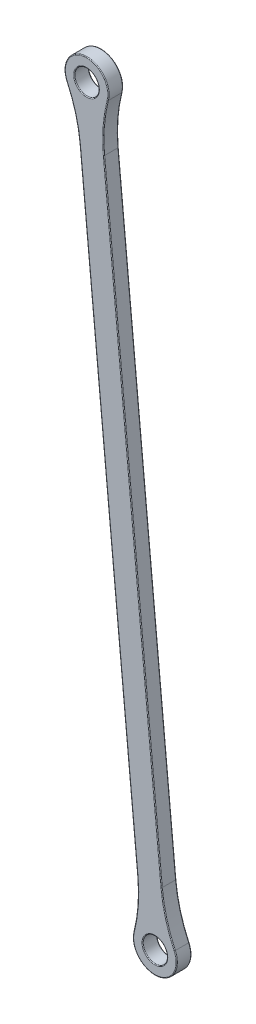
ISO-10303-21;
HEADER;
FILE_DESCRIPTION(('STEP AP214'),'2;1');
FILE_NAME('part.step','',(''),(''),'','','');
FILE_SCHEMA(('AUTOMOTIVE_DESIGN { 1 0 10303 214 1 1 1 1 }'));
ENDSEC;
DATA;
#1=APPLICATION_CONTEXT('core data for automotive mechanical design processes');
#2=APPLICATION_PROTOCOL_DEFINITION('international standard','automotive_design',2000,#1);
#3=PRODUCT_CONTEXT('',#1,'mechanical');
#4=PRODUCT('Part','Part','',(#3));
#5=PRODUCT_RELATED_PRODUCT_CATEGORY('part','',(#4));
#6=PRODUCT_DEFINITION_FORMATION('','',#4);
#7=PRODUCT_DEFINITION_CONTEXT('part definition',#1,'design');
#8=PRODUCT_DEFINITION('design','',#6,#7);
#9=PRODUCT_DEFINITION_SHAPE('','',#8);
#10=(LENGTH_UNIT() NAMED_UNIT(*) SI_UNIT(.MILLI.,.METRE.));
#11=(NAMED_UNIT(*) PLANE_ANGLE_UNIT() SI_UNIT($,.RADIAN.));
#12=(NAMED_UNIT(*) SI_UNIT($,.STERADIAN.) SOLID_ANGLE_UNIT());
#13=UNCERTAINTY_MEASURE_WITH_UNIT(LENGTH_MEASURE(1.E-05),#10,'distance_accuracy_value','');
#14=(GEOMETRIC_REPRESENTATION_CONTEXT(3) GLOBAL_UNCERTAINTY_ASSIGNED_CONTEXT((#13)) GLOBAL_UNIT_ASSIGNED_CONTEXT((#10,
#11,#12)) REPRESENTATION_CONTEXT('',''));
#15=CARTESIAN_POINT('',(0.,0.,0.));
#16=DIRECTION('',(0.,0.,1.));
#17=DIRECTION('',(1.,0.,0.));
#18=AXIS2_PLACEMENT_3D('',#15,#16,#17);
#19=CARTESIAN_POINT('',(14.4999999999998,81.4999999999997,-3.));
#20=DIRECTION('',(0.,0.,1.));
#21=DIRECTION('',(1.,0.,0.));
#22=AXIS2_PLACEMENT_3D('',#19,#20,#21);
#23=CYLINDRICAL_SURFACE('',#22,4.50000000000001);
#24=DIRECTION('',(0.,0.,1.));
#25=VECTOR('',#24,1.);
#26=CARTESIAN_POINT('',(10.1367892633789,82.601086766715,-3.));
#27=LINE('',#26,#25);
#28=CARTESIAN_POINT('',(10.1367892633789,82.601086766715,-0.15));
#29=VERTEX_POINT('',#28);
#30=CARTESIAN_POINT('',(10.1367892633789,82.601086766715,-2.85));
#31=VERTEX_POINT('',#30);
#32=EDGE_CURVE('E307',#29,#31,#27,.F.);
#33=ORIENTED_EDGE('',*,*,#32,.T.);
#34=CARTESIAN_POINT('',(14.4999999999998,81.4999999999997,-2.85));
#35=DIRECTION('',(0.,0.,1.));
#36=DIRECTION('',(1.,0.,0.));
#37=AXIS2_PLACEMENT_3D('',#34,#35,#36);
#38=CIRCLE('',#37,4.50000000000001);
#39=CARTESIAN_POINT('',(18.5768419706987,83.4050878053116,-2.85));
#40=VERTEX_POINT('',#39);
#41=EDGE_CURVE('E213',#31,#40,#38,.T.);
#42=ORIENTED_EDGE('',*,*,#41,.T.);
#43=DIRECTION('',(0.,0.,1.));
#44=VECTOR('',#43,1.);
#45=CARTESIAN_POINT('',(18.5768419706987,83.4050878053116,-3.));
#46=LINE('',#45,#44);
#47=CARTESIAN_POINT('',(18.5768419706987,83.4050878053116,-0.15));
#48=VERTEX_POINT('',#47);
#49=EDGE_CURVE('E311',#40,#48,#46,.T.);
#50=ORIENTED_EDGE('',*,*,#49,.T.);
#51=CARTESIAN_POINT('',(14.4999999999998,81.4999999999997,-0.15));
#52=DIRECTION('',(0.,0.,1.));
#53=DIRECTION('',(1.,0.,0.));
#54=AXIS2_PLACEMENT_3D('',#51,#52,#53);
#55=CIRCLE('',#54,4.50000000000001);
#56=EDGE_CURVE('E211',#48,#29,#55,.F.);
#57=ORIENTED_EDGE('',*,*,#56,.T.);
#58=EDGE_LOOP('',(#33,#42,#50,#57));
#59=FACE_BOUND('',#58,.T.);
#60=ADVANCED_FACE('F35',(#59),#23,.T.);
#61=CARTESIAN_POINT('',(19.574756896066,1.86469509379533,-3.));
#62=DIRECTION('',(0.995493396247977,0.0948308917319081,0.));
#63=DIRECTION('',(-0.0948308917319081,0.995493396247977,0.));
#64=AXIS2_PLACEMENT_3D('',#61,#62,#63);
#65=PLANE('',#64);
#66=DIRECTION('',(0.,0.,1.));
#67=VECTOR('',#66,1.);
#68=CARTESIAN_POINT('',(-0.925958530907808,217.072276222599,-3.));
#69=LINE('',#68,#67);
#70=CARTESIAN_POINT('',(-0.925958530907808,217.072276222599,-0.15));
#71=VERTEX_POINT('',#70);
#72=CARTESIAN_POINT('',(-0.925958530907808,217.072276222599,-2.85));
#73=VERTEX_POINT('',#72);
#74=EDGE_CURVE('E344',#71,#73,#69,.F.);
#75=ORIENTED_EDGE('',*,*,#74,.T.);
#76=DIRECTION('',(-0.0948308917319081,0.995493396247977,0.));
#77=VECTOR('',#76,1.);
#78=CARTESIAN_POINT('',(19.574756896066,1.86469509379533,-2.85));
#79=LINE('',#78,#77);
#80=CARTESIAN_POINT('',(10.9135195733452,92.7865919634412,-2.85));
#81=VERTEX_POINT('',#80);
#82=EDGE_CURVE('E204',#73,#81,#79,.F.);
#83=ORIENTED_EDGE('',*,*,#82,.T.);
#84=DIRECTION('',(0.,0.,-1.));
#85=VECTOR('',#84,1.);
#86=CARTESIAN_POINT('',(10.9135195733452,92.7865919634412,0.));
#87=LINE('',#86,#85);
#88=CARTESIAN_POINT('',(10.9135195733452,92.7865919634412,-0.15));
#89=VERTEX_POINT('',#88);
#90=EDGE_CURVE('E339',#81,#89,#87,.F.);
#91=ORIENTED_EDGE('',*,*,#90,.T.);
#92=DIRECTION('',(-0.0948308917319081,0.995493396247977,0.));
#93=VECTOR('',#92,1.);
#94=CARTESIAN_POINT('',(-0.925958530907812,217.072276222599,-0.15));
#95=LINE('',#94,#93);
#96=EDGE_CURVE('E202',#89,#71,#95,.T.);
#97=ORIENTED_EDGE('',*,*,#96,.T.);
#98=EDGE_LOOP('',(#75,#83,#91,#97));
#99=FACE_BOUND('',#98,.T.);
#100=ADVANCED_FACE('F373',(#99),#65,.F.);
#101=CARTESIAN_POINT('',(0.4650280236774,228.833022644701,-3.));
#102=DIRECTION('',(0.,0.,1.));
#103=DIRECTION('',(1.,0.,0.));
#104=AXIS2_PLACEMENT_3D('',#101,#102,#103);
#105=CYLINDRICAL_SURFACE('',#104,4.50000000000002);
#106=DIRECTION('',(0.,0.,1.));
#107=VECTOR('',#106,1.);
#108=CARTESIAN_POINT('',(4.82823876029837,227.731935877985,-3.));
#109=LINE('',#108,#107);
#110=CARTESIAN_POINT('',(4.82823876029837,227.731935877985,-0.15));
#111=VERTEX_POINT('',#110);
#112=CARTESIAN_POINT('',(4.82823876029837,227.731935877985,-2.85));
#113=VERTEX_POINT('',#112);
#114=EDGE_CURVE('E262',#111,#113,#109,.F.);
#115=ORIENTED_EDGE('',*,*,#114,.T.);
#116=CARTESIAN_POINT('',(0.4650280236774,228.833022644701,-2.85));
#117=DIRECTION('',(0.,0.,1.));
#118=DIRECTION('',(1.,0.,0.));
#119=AXIS2_PLACEMENT_3D('',#116,#117,#118);
#120=CIRCLE('',#119,4.50000000000002);
#121=CARTESIAN_POINT('',(-3.61181394702147,226.927934839389,-2.85));
#122=VERTEX_POINT('',#121);
#123=EDGE_CURVE('E196',#113,#122,#120,.T.);
#124=ORIENTED_EDGE('',*,*,#123,.T.);
#125=DIRECTION('',(0.,0.,1.));
#126=VECTOR('',#125,1.);
#127=CARTESIAN_POINT('',(-3.61181394702147,226.927934839389,-3.));
#128=LINE('',#127,#126);
#129=CARTESIAN_POINT('',(-3.61181394702147,226.927934839389,-0.15));
#130=VERTEX_POINT('',#129);
#131=EDGE_CURVE('E337',#122,#130,#128,.T.);
#132=ORIENTED_EDGE('',*,*,#131,.T.);
#133=CARTESIAN_POINT('',(0.4650280236774,228.833022644701,-0.15));
#134=DIRECTION('',(0.,0.,1.));
#135=DIRECTION('',(1.,0.,0.));
#136=AXIS2_PLACEMENT_3D('',#133,#134,#135);
#137=CIRCLE('',#136,4.50000000000002);
#138=EDGE_CURVE('E194',#130,#111,#137,.F.);
#139=ORIENTED_EDGE('',*,*,#138,.T.);
#140=EDGE_LOOP('',(#115,#124,#132,#139));
#141=FACE_BOUND('',#140,.T.);
#142=ADVANCED_FACE('F336',(#141),#105,.T.);
#143=CARTESIAN_POINT('',(24.5522238773059,2.33884955245488,-3.));
#144=DIRECTION('',(0.995493396247977,0.0948308917319081,0.));
#145=DIRECTION('',(-0.0948308917319081,0.995493396247977,0.));
#146=AXIS2_PLACEMENT_3D('',#143,#144,#145);
#147=PLANE('',#146);
#148=DIRECTION('',(0.,0.,1.));
#149=VECTOR('',#148,1.);
#150=CARTESIAN_POINT('',(15.890986554585,93.2607464221008,-3.));
#151=LINE('',#150,#149);
#152=CARTESIAN_POINT('',(15.890986554585,93.2607464221008,-0.15));
#153=VERTEX_POINT('',#152);
#154=CARTESIAN_POINT('',(15.890986554585,93.2607464221008,-2.85));
#155=VERTEX_POINT('',#154);
#156=EDGE_CURVE('E306',#153,#155,#151,.F.);
#157=ORIENTED_EDGE('',*,*,#156,.T.);
#158=DIRECTION('',(-0.0948308917319081,0.995493396247977,0.));
#159=VECTOR('',#158,1.);
#160=CARTESIAN_POINT('',(4.05150845033207,217.546430681259,-2.85));
#161=LINE('',#160,#159);
#162=CARTESIAN_POINT('',(4.05150845033207,217.546430681259,-2.85));
#163=VERTEX_POINT('',#162);
#164=EDGE_CURVE('E221',#155,#163,#161,.T.);
#165=ORIENTED_EDGE('',*,*,#164,.T.);
#166=DIRECTION('',(0.,0.,-1.));
#167=VECTOR('',#166,1.);
#168=CARTESIAN_POINT('',(4.05150845033207,217.546430681259,0.));
#169=LINE('',#168,#167);
#170=CARTESIAN_POINT('',(4.05150845033207,217.546430681259,-0.15));
#171=VERTEX_POINT('',#170);
#172=EDGE_CURVE('E300',#163,#171,#169,.F.);
#173=ORIENTED_EDGE('',*,*,#172,.T.);
#174=DIRECTION('',(-0.0948308917319081,0.995493396247977,0.));
#175=VECTOR('',#174,1.);
#176=CARTESIAN_POINT('',(24.5522238773059,2.33884955245488,-0.15));
#177=LINE('',#176,#175);
#178=EDGE_CURVE('E219',#171,#153,#177,.F.);
#179=ORIENTED_EDGE('',*,*,#178,.T.);
#180=EDGE_LOOP('',(#157,#165,#173,#179));
#181=FACE_BOUND('',#180,.T.);
#182=ADVANCED_FACE('F304',(#181),#147,.T.);
#183=CARTESIAN_POINT('',(0.4650280236774,228.833022644701,-3.));
#184=DIRECTION('',(0.,0.,1.));
#185=DIRECTION('',(1.,0.,0.));
#186=AXIS2_PLACEMENT_3D('',#183,#184,#185);
#187=CYLINDRICAL_SURFACE('',#186,2.5);
#188=CARTESIAN_POINT('',(0.4650280236774,228.833022644701,-2.85));
#189=DIRECTION('',(0.,0.,1.));
#190=DIRECTION('',(1.,0.,0.));
#191=AXIS2_PLACEMENT_3D('',#188,#189,#190);
#192=CIRCLE('',#191,2.5);
#193=CARTESIAN_POINT('',(2.9650280236774,228.833022644701,-2.85));
#194=VERTEX_POINT('',#193);
#195=EDGE_CURVE('E226',#194,#194,#192,.F.);
#196=ORIENTED_EDGE('',*,*,#195,.T.);
#197=EDGE_LOOP('',(#196));
#198=FACE_BOUND('',#197,.T.);
#199=CARTESIAN_POINT('',(0.4650280236774,228.833022644701,-0.15));
#200=DIRECTION('',(0.,0.,1.));
#201=DIRECTION('',(1.,0.,0.));
#202=AXIS2_PLACEMENT_3D('',#199,#200,#201);
#203=CIRCLE('',#202,2.5);
#204=CARTESIAN_POINT('',(2.9650280236774,228.833022644701,-0.15));
#205=VERTEX_POINT('',#204);
#206=EDGE_CURVE('E223',#205,#205,#203,.T.);
#207=ORIENTED_EDGE('',*,*,#206,.T.);
#208=EDGE_LOOP('',(#207));
#209=FACE_BOUND('',#208,.T.);
#210=ADVANCED_FACE('F416',(#198,#209),#187,.F.);
#211=CARTESIAN_POINT('',(14.4999999999998,81.4999999999997,-3.));
#212=DIRECTION('',(0.,0.,1.));
#213=DIRECTION('',(1.,0.,0.));
#214=AXIS2_PLACEMENT_3D('',#211,#212,#213);
#215=CYLINDRICAL_SURFACE('',#214,2.5);
#216=CARTESIAN_POINT('',(14.4999999999998,81.4999999999997,-2.85));
#217=DIRECTION('',(0.,0.,1.));
#218=DIRECTION('',(1.,0.,0.));
#219=AXIS2_PLACEMENT_3D('',#216,#217,#218);
#220=CIRCLE('',#219,2.5);
#221=CARTESIAN_POINT('',(16.9999999999998,81.4999999999997,-2.85));
#222=VERTEX_POINT('',#221);
#223=EDGE_CURVE('E188',#222,#222,#220,.F.);
#224=ORIENTED_EDGE('',*,*,#223,.T.);
#225=EDGE_LOOP('',(#224));
#226=FACE_BOUND('',#225,.T.);
#227=CARTESIAN_POINT('',(14.4999999999998,81.4999999999997,-0.15));
#228=DIRECTION('',(0.,0.,1.));
#229=DIRECTION('',(1.,0.,0.));
#230=AXIS2_PLACEMENT_3D('',#227,#228,#229);
#231=CIRCLE('',#230,2.5);
#232=CARTESIAN_POINT('',(16.9999999999998,81.4999999999997,-0.15));
#233=VERTEX_POINT('',#232);
#234=EDGE_CURVE('E180',#233,#233,#231,.T.);
#235=ORIENTED_EDGE('',*,*,#234,.T.);
#236=EDGE_LOOP('',(#235));
#237=FACE_BOUND('',#236,.T.);
#238=ADVANCED_FACE('F419',(#226,#237),#215,.F.);
#239=CARTESIAN_POINT('',(0.,0.,-3.));
#240=DIRECTION('',(0.,0.,1.));
#241=DIRECTION('',(1.,0.,0.));
#242=AXIS2_PLACEMENT_3D('',#239,#240,#241);
#243=PLANE('',#242);
#244=CARTESIAN_POINT('',(14.4999999999998,81.4999999999997,-3.));
#245=DIRECTION('',(0.,0.,1.));
#246=DIRECTION('',(1.,0.,0.));
#247=AXIS2_PLACEMENT_3D('',#244,#245,#246);
#248=CIRCLE('',#247,2.65);
#249=CARTESIAN_POINT('',(17.1499999999998,81.4999999999997,-3.));
#250=VERTEX_POINT('',#249);
#251=EDGE_CURVE('E177',#250,#250,#248,.T.);
#252=ORIENTED_EDGE('',*,*,#251,.T.);
#253=EDGE_LOOP('',(#252));
#254=FACE_BOUND('',#253,.T.);
#255=CARTESIAN_POINT('',(0.4650280236774,228.833022644701,-3.));
#256=DIRECTION('',(0.,0.,1.));
#257=DIRECTION('',(1.,0.,0.));
#258=AXIS2_PLACEMENT_3D('',#255,#256,#257);
#259=CIRCLE('',#258,4.35000000000002);
#260=CARTESIAN_POINT('',(-3.47591921466484,226.991437766232,-3.));
#261=VERTEX_POINT('',#260);
#262=CARTESIAN_POINT('',(4.682798402411,227.768638770209,-3.));
#263=VERTEX_POINT('',#262);
#264=EDGE_CURVE('E175',#261,#263,#259,.F.);
#265=ORIENTED_EDGE('',*,*,#264,.T.);
#266=CARTESIAN_POINT('',(33.9163103377714,220.391357433216,-3.));
#267=DIRECTION('',(0.,0.,1.));
#268=DIRECTION('',(1.,0.,0.));
#269=AXIS2_PLACEMENT_3D('',#266,#267,#268);
#270=CIRCLE('',#269,30.15);
#271=CARTESIAN_POINT('',(3.90218444089488,217.532206047499,-3.));
#272=VERTEX_POINT('',#271);
#273=EDGE_CURVE('E155',#263,#272,#270,.T.);
#274=ORIENTED_EDGE('',*,*,#273,.T.);
#275=DIRECTION('',(-0.0948308917319081,0.995493396247977,0.));
#276=VECTOR('',#275,1.);
#277=CARTESIAN_POINT('',(15.7416625451479,93.246521788341,-3.));
#278=LINE('',#277,#276);
#279=CARTESIAN_POINT('',(15.7416625451479,93.246521788341,-3.));
#280=VERTEX_POINT('',#279);
#281=EDGE_CURVE('E163',#272,#280,#278,.F.);
#282=ORIENTED_EDGE('',*,*,#281,.T.);
#283=CARTESIAN_POINT('',(45.7557884420244,96.105673174058,-3.));
#284=DIRECTION('',(0.,0.,1.));
#285=DIRECTION('',(1.,0.,0.));
#286=AXIS2_PLACEMENT_3D('',#283,#284,#285);
#287=CIRCLE('',#286,30.15);
#288=CARTESIAN_POINT('',(18.4409472383421,83.3415848784679,-3.));
#289=VERTEX_POINT('',#288);
#290=EDGE_CURVE('E169',#280,#289,#287,.T.);
#291=ORIENTED_EDGE('',*,*,#290,.T.);
#292=CARTESIAN_POINT('',(14.4999999999998,81.4999999999997,-3.));
#293=DIRECTION('',(0.,0.,1.));
#294=DIRECTION('',(1.,0.,0.));
#295=AXIS2_PLACEMENT_3D('',#292,#293,#294);
#296=CIRCLE('',#295,4.35000000000001);
#297=CARTESIAN_POINT('',(10.2822296212662,82.5643838744912,-3.));
#298=VERTEX_POINT('',#297);
#299=EDGE_CURVE('E318',#289,#298,#296,.F.);
#300=ORIENTED_EDGE('',*,*,#299,.T.);
#301=CARTESIAN_POINT('',(-18.9512823140941,89.941665211484,-3.));
#302=DIRECTION('',(0.,0.,1.));
#303=DIRECTION('',(1.,0.,0.));
#304=AXIS2_PLACEMENT_3D('',#301,#302,#303);
#305=CIRCLE('',#304,30.15);
#306=CARTESIAN_POINT('',(11.0628435827824,92.800816597201,-3.));
#307=VERTEX_POINT('',#306);
#308=EDGE_CURVE('E320',#298,#307,#305,.T.);
#309=ORIENTED_EDGE('',*,*,#308,.T.);
#310=DIRECTION('',(-0.0948308917319081,0.995493396247977,0.));
#311=VECTOR('',#310,1.);
#312=CARTESIAN_POINT('',(19.7240809055032,1.87891972755512,-3.));
#313=LINE('',#312,#311);
#314=CARTESIAN_POINT('',(-0.776634521470609,217.086500856359,-3.));
#315=VERTEX_POINT('',#314);
#316=EDGE_CURVE('E322',#307,#315,#313,.T.);
#317=ORIENTED_EDGE('',*,*,#316,.T.);
#318=CARTESIAN_POINT('',(-30.7907604183471,214.227349470642,-3.));
#319=DIRECTION('',(0.,0.,1.));
#320=DIRECTION('',(1.,0.,0.));
#321=AXIS2_PLACEMENT_3D('',#318,#319,#320);
#322=CIRCLE('',#321,30.15);
#323=EDGE_CURVE('E182',#315,#261,#322,.T.);
#324=ORIENTED_EDGE('',*,*,#323,.T.);
#325=EDGE_LOOP('',(#265,#274,#282,#291,#300,#309,#317,#324));
#326=FACE_BOUND('',#325,.T.);
#327=CARTESIAN_POINT('',(0.4650280236774,228.833022644701,-3.));
#328=DIRECTION('',(0.,0.,1.));
#329=DIRECTION('',(1.,0.,0.));
#330=AXIS2_PLACEMENT_3D('',#327,#328,#329);
#331=CIRCLE('',#330,2.65);
#332=CARTESIAN_POINT('',(3.1150280236774,228.833022644701,-3.));
#333=VERTEX_POINT('',#332);
#334=EDGE_CURVE('E170',#333,#333,#331,.T.);
#335=ORIENTED_EDGE('',*,*,#334,.T.);
#336=EDGE_LOOP('',(#335));
#337=FACE_BOUND('',#336,.T.);
#338=ADVANCED_FACE('F172',(#254,#326,#337),#243,.F.);
#339=CARTESIAN_POINT('',(0.,0.,0.));
#340=DIRECTION('',(0.,0.,1.));
#341=DIRECTION('',(1.,0.,0.));
#342=AXIS2_PLACEMENT_3D('',#339,#340,#341);
#343=PLANE('',#342);
#344=CARTESIAN_POINT('',(14.4999999999998,81.4999999999997,0.));
#345=DIRECTION('',(0.,0.,1.));
#346=DIRECTION('',(1.,0.,0.));
#347=AXIS2_PLACEMENT_3D('',#344,#345,#346);
#348=CIRCLE('',#347,2.65);
#349=CARTESIAN_POINT('',(17.1499999999998,81.4999999999997,0.));
#350=VERTEX_POINT('',#349);
#351=EDGE_CURVE('E11',#350,#350,#348,.F.);
#352=ORIENTED_EDGE('',*,*,#351,.T.);
#353=EDGE_LOOP('',(#352));
#354=FACE_BOUND('',#353,.T.);
#355=DIRECTION('',(-0.0948308917319081,0.995493396247977,0.));
#356=VECTOR('',#355,1.);
#357=CARTESIAN_POINT('',(11.0628435827824,92.8008165972011,0.));
#358=LINE('',#357,#356);
#359=CARTESIAN_POINT('',(-0.776634521470617,217.086500856359,0.));
#360=VERTEX_POINT('',#359);
#361=CARTESIAN_POINT('',(11.0628435827824,92.800816597201,0.));
#362=VERTEX_POINT('',#361);
#363=EDGE_CURVE('E52',#360,#362,#358,.F.);
#364=ORIENTED_EDGE('',*,*,#363,.T.);
#365=CARTESIAN_POINT('',(-18.9512823140941,89.941665211484,0.));
#366=DIRECTION('',(0.,0.,1.));
#367=DIRECTION('',(1.,0.,0.));
#368=AXIS2_PLACEMENT_3D('',#365,#366,#367);
#369=CIRCLE('',#368,30.15);
#370=CARTESIAN_POINT('',(10.2822296212662,82.5643838744912,0.));
#371=VERTEX_POINT('',#370);
#372=EDGE_CURVE('E44',#362,#371,#369,.F.);
#373=ORIENTED_EDGE('',*,*,#372,.T.);
#374=CARTESIAN_POINT('',(14.4999999999998,81.4999999999997,0.));
#375=DIRECTION('',(0.,0.,1.));
#376=DIRECTION('',(1.,0.,0.));
#377=AXIS2_PLACEMENT_3D('',#374,#375,#376);
#378=CIRCLE('',#377,4.35000000000001);
#379=CARTESIAN_POINT('',(18.4409472383421,83.3415848784679,0.));
#380=VERTEX_POINT('',#379);
#381=EDGE_CURVE('E232',#371,#380,#378,.T.);
#382=ORIENTED_EDGE('',*,*,#381,.T.);
#383=CARTESIAN_POINT('',(45.7557884420244,96.105673174058,0.));
#384=DIRECTION('',(0.,0.,1.));
#385=DIRECTION('',(1.,0.,0.));
#386=AXIS2_PLACEMENT_3D('',#383,#384,#385);
#387=CIRCLE('',#386,30.15);
#388=CARTESIAN_POINT('',(15.7416625451479,93.246521788341,0.));
#389=VERTEX_POINT('',#388);
#390=EDGE_CURVE('E234',#380,#389,#387,.F.);
#391=ORIENTED_EDGE('',*,*,#390,.T.);
#392=DIRECTION('',(-0.0948308917319081,0.995493396247977,0.));
#393=VECTOR('',#392,1.);
#394=CARTESIAN_POINT('',(24.4028998678687,2.32462491869509,0.));
#395=LINE('',#394,#393);
#396=CARTESIAN_POINT('',(3.90218444089488,217.532206047499,0.));
#397=VERTEX_POINT('',#396);
#398=EDGE_CURVE('E236',#389,#397,#395,.T.);
#399=ORIENTED_EDGE('',*,*,#398,.T.);
#400=CARTESIAN_POINT('',(33.9163103377714,220.391357433216,0.));
#401=DIRECTION('',(0.,0.,1.));
#402=DIRECTION('',(1.,0.,0.));
#403=AXIS2_PLACEMENT_3D('',#400,#401,#402);
#404=CIRCLE('',#403,30.15);
#405=CARTESIAN_POINT('',(4.682798402411,227.768638770209,0.));
#406=VERTEX_POINT('',#405);
#407=EDGE_CURVE('E238',#397,#406,#404,.F.);
#408=ORIENTED_EDGE('',*,*,#407,.T.);
#409=CARTESIAN_POINT('',(0.4650280236774,228.833022644701,0.));
#410=DIRECTION('',(0.,0.,1.));
#411=DIRECTION('',(1.,0.,0.));
#412=AXIS2_PLACEMENT_3D('',#409,#410,#411);
#413=CIRCLE('',#412,4.35000000000002);
#414=CARTESIAN_POINT('',(-3.47591921466484,226.991437766232,0.));
#415=VERTEX_POINT('',#414);
#416=EDGE_CURVE('E240',#406,#415,#413,.T.);
#417=ORIENTED_EDGE('',*,*,#416,.T.);
#418=CARTESIAN_POINT('',(-30.7907604183471,214.227349470642,0.));
#419=DIRECTION('',(0.,0.,1.));
#420=DIRECTION('',(1.,0.,0.));
#421=AXIS2_PLACEMENT_3D('',#418,#419,#420);
#422=CIRCLE('',#421,30.15);
#423=EDGE_CURVE('E57',#415,#360,#422,.F.);
#424=ORIENTED_EDGE('',*,*,#423,.T.);
#425=EDGE_LOOP('',(#364,#373,#382,#391,#399,#408,#417,#424));
#426=FACE_BOUND('',#425,.T.);
#427=CARTESIAN_POINT('',(0.4650280236774,228.833022644701,0.));
#428=DIRECTION('',(0.,0.,1.));
#429=DIRECTION('',(1.,0.,0.));
#430=AXIS2_PLACEMENT_3D('',#427,#428,#429);
#431=CIRCLE('',#430,2.65);
#432=CARTESIAN_POINT('',(3.1150280236774,228.833022644701,0.));
#433=VERTEX_POINT('',#432);
#434=EDGE_CURVE('E229',#433,#433,#431,.F.);
#435=ORIENTED_EDGE('',*,*,#434,.T.);
#436=EDGE_LOOP('',(#435));
#437=FACE_BOUND('',#436,.T.);
#438=ADVANCED_FACE('F392',(#354,#426,#437),#343,.T.);
#439=CARTESIAN_POINT('',(-30.7907604183471,214.227349470642,-3.));
#440=DIRECTION('',(0.,0.,1.));
#441=DIRECTION('',(1.,0.,0.));
#442=AXIS2_PLACEMENT_3D('',#439,#440,#441);
#443=CYLINDRICAL_SURFACE('',#442,30.);
#444=ORIENTED_EDGE('',*,*,#131,.F.);
#445=CARTESIAN_POINT('',(-30.7907604183471,214.227349470642,-2.85));
#446=DIRECTION('',(0.,0.,1.));
#447=DIRECTION('',(1.,0.,0.));
#448=AXIS2_PLACEMENT_3D('',#445,#446,#447);
#449=CIRCLE('',#448,30.);
#450=EDGE_CURVE('E200',#122,#73,#449,.F.);
#451=ORIENTED_EDGE('',*,*,#450,.T.);
#452=ORIENTED_EDGE('',*,*,#74,.F.);
#453=CARTESIAN_POINT('',(-30.7907604183471,214.227349470642,-0.15));
#454=DIRECTION('',(0.,0.,1.));
#455=DIRECTION('',(1.,0.,0.));
#456=AXIS2_PLACEMENT_3D('',#453,#454,#455);
#457=CIRCLE('',#456,30.);
#458=EDGE_CURVE('E198',#71,#130,#457,.T.);
#459=ORIENTED_EDGE('',*,*,#458,.T.);
#460=EDGE_LOOP('',(#444,#451,#452,#459));
#461=FACE_BOUND('',#460,.T.);
#462=ADVANCED_FACE('F421',(#461),#443,.F.);
#463=CARTESIAN_POINT('',(-18.9512823140941,89.941665211484,-3.));
#464=DIRECTION('',(0.,0.,1.));
#465=DIRECTION('',(1.,0.,0.));
#466=AXIS2_PLACEMENT_3D('',#463,#464,#465);
#467=CYLINDRICAL_SURFACE('',#466,30.);
#468=ORIENTED_EDGE('',*,*,#90,.F.);
#469=CARTESIAN_POINT('',(-18.9512823140941,89.941665211484,-2.85));
#470=DIRECTION('',(0.,0.,1.));
#471=DIRECTION('',(1.,0.,0.));
#472=AXIS2_PLACEMENT_3D('',#469,#470,#471);
#473=CIRCLE('',#472,30.);
#474=EDGE_CURVE('E209',#81,#31,#473,.F.);
#475=ORIENTED_EDGE('',*,*,#474,.T.);
#476=ORIENTED_EDGE('',*,*,#32,.F.);
#477=CARTESIAN_POINT('',(-18.9512823140941,89.941665211484,-0.15));
#478=DIRECTION('',(0.,0.,1.));
#479=DIRECTION('',(1.,0.,0.));
#480=AXIS2_PLACEMENT_3D('',#477,#478,#479);
#481=CIRCLE('',#480,30.);
#482=EDGE_CURVE('E206',#29,#89,#481,.T.);
#483=ORIENTED_EDGE('',*,*,#482,.T.);
#484=EDGE_LOOP('',(#468,#475,#476,#483));
#485=FACE_BOUND('',#484,.T.);
#486=ADVANCED_FACE('F370',(#485),#467,.F.);
#487=CARTESIAN_POINT('',(45.7557884420244,96.105673174058,-3.));
#488=DIRECTION('',(0.,0.,1.));
#489=DIRECTION('',(1.,0.,0.));
#490=AXIS2_PLACEMENT_3D('',#487,#488,#489);
#491=CYLINDRICAL_SURFACE('',#490,30.);
#492=ORIENTED_EDGE('',*,*,#49,.F.);
#493=CARTESIAN_POINT('',(45.7557884420244,96.105673174058,-2.85));
#494=DIRECTION('',(0.,0.,1.));
#495=DIRECTION('',(1.,0.,0.));
#496=AXIS2_PLACEMENT_3D('',#493,#494,#495);
#497=CIRCLE('',#496,30.);
#498=EDGE_CURVE('E217',#40,#155,#497,.F.);
#499=ORIENTED_EDGE('',*,*,#498,.T.);
#500=ORIENTED_EDGE('',*,*,#156,.F.);
#501=CARTESIAN_POINT('',(45.7557884420244,96.105673174058,-0.15));
#502=DIRECTION('',(0.,0.,1.));
#503=DIRECTION('',(1.,0.,0.));
#504=AXIS2_PLACEMENT_3D('',#501,#502,#503);
#505=CIRCLE('',#504,30.);
#506=EDGE_CURVE('E215',#153,#48,#505,.T.);
#507=ORIENTED_EDGE('',*,*,#506,.T.);
#508=EDGE_LOOP('',(#492,#499,#500,#507));
#509=FACE_BOUND('',#508,.T.);
#510=ADVANCED_FACE('F389',(#509),#491,.F.);
#511=CARTESIAN_POINT('',(33.9163103377714,220.391357433216,-3.));
#512=DIRECTION('',(0.,0.,1.));
#513=DIRECTION('',(1.,0.,0.));
#514=AXIS2_PLACEMENT_3D('',#511,#512,#513);
#515=CYLINDRICAL_SURFACE('',#514,30.);
#516=ORIENTED_EDGE('',*,*,#172,.F.);
#517=CARTESIAN_POINT('',(33.9163103377714,220.391357433216,-2.85));
#518=DIRECTION('',(0.,0.,1.));
#519=DIRECTION('',(1.,0.,0.));
#520=AXIS2_PLACEMENT_3D('',#517,#518,#519);
#521=CIRCLE('',#520,30.);
#522=EDGE_CURVE('E157',#163,#113,#521,.F.);
#523=ORIENTED_EDGE('',*,*,#522,.T.);
#524=ORIENTED_EDGE('',*,*,#114,.F.);
#525=CARTESIAN_POINT('',(33.9163103377714,220.391357433216,-0.15));
#526=DIRECTION('',(0.,0.,1.));
#527=DIRECTION('',(1.,0.,0.));
#528=AXIS2_PLACEMENT_3D('',#525,#526,#527);
#529=CIRCLE('',#528,30.);
#530=EDGE_CURVE('E191',#111,#171,#529,.T.);
#531=ORIENTED_EDGE('',*,*,#530,.T.);
#532=EDGE_LOOP('',(#516,#523,#524,#531));
#533=FACE_BOUND('',#532,.T.);
#534=ADVANCED_FACE('F299',(#533),#515,.F.);
#535=CARTESIAN_POINT('',(14.4999999999998,81.4999999999997,-2.85));
#536=DIRECTION('',(0.,0.,1.));
#537=DIRECTION('',(1.,0.,0.));
#538=AXIS2_PLACEMENT_3D('',#535,#536,#537);
#539=TOROIDAL_SURFACE('',#538,2.65,0.15);
#540=ORIENTED_EDGE('',*,*,#223,.F.);
#541=EDGE_LOOP('',(#540));
#542=FACE_BOUND('',#541,.T.);
#543=ORIENTED_EDGE('',*,*,#251,.F.);
#544=EDGE_LOOP('',(#543));
#545=FACE_BOUND('',#544,.T.);
#546=ADVANCED_FACE('F431',(#542,#545),#539,.T.);
#547=CARTESIAN_POINT('',(-18.9512823140941,89.941665211484,-2.85));
#548=DIRECTION('',(0.,0.,1.));
#549=DIRECTION('',(1.,0.,0.));
#550=AXIS2_PLACEMENT_3D('',#547,#548,#549);
#551=TOROIDAL_SURFACE('',#550,30.15,0.15);
#552=CARTESIAN_POINT('',(10.2822296212662,82.5643838744912,-2.85));
#553=DIRECTION('',(-0.244685948158996,-0.969602385915759,0.));
#554=DIRECTION('',(0.969602385915759,-0.244685948158996,0.));
#555=AXIS2_PLACEMENT_3D('',#552,#553,#554);
#556=CIRCLE('',#555,0.15);
#557=EDGE_CURVE('E256',#31,#298,#556,.T.);
#558=ORIENTED_EDGE('',*,*,#557,.F.);
#559=ORIENTED_EDGE('',*,*,#474,.F.);
#560=CARTESIAN_POINT('',(11.0628435827824,92.800816597201,-2.85));
#561=DIRECTION('',(-0.0948308917319178,0.995493396247976,0.));
#562=DIRECTION('',(-0.995493396247976,-0.0948308917319178,0.));
#563=AXIS2_PLACEMENT_3D('',#560,#561,#562);
#564=CIRCLE('',#563,0.15);
#565=EDGE_CURVE('E259',#307,#81,#564,.T.);
#566=ORIENTED_EDGE('',*,*,#565,.F.);
#567=ORIENTED_EDGE('',*,*,#308,.F.);
#568=EDGE_LOOP('',(#558,#559,#566,#567));
#569=FACE_BOUND('',#568,.T.);
#570=ADVANCED_FACE('F382',(#569),#551,.T.);
#571=CARTESIAN_POINT('',(19.7240809055032,1.87891972755512,-2.85));
#572=DIRECTION('',(-0.0948308917319081,0.995493396247977,0.));
#573=DIRECTION('',(-0.995493396247977,-0.0948308917319081,0.));
#574=AXIS2_PLACEMENT_3D('',#571,#572,#573);
#575=CYLINDRICAL_SURFACE('',#574,0.15);
#576=ORIENTED_EDGE('',*,*,#565,.T.);
#577=ORIENTED_EDGE('',*,*,#82,.F.);
#578=CARTESIAN_POINT('',(-0.776634521470609,217.086500856359,-2.85));
#579=DIRECTION('',(-0.0948308917318256,0.995493396247985,0.));
#580=DIRECTION('',(-0.995493396247985,-0.0948308917318256,0.));
#581=AXIS2_PLACEMENT_3D('',#578,#579,#580);
#582=CIRCLE('',#581,0.15);
#583=EDGE_CURVE('E253',#315,#73,#582,.T.);
#584=ORIENTED_EDGE('',*,*,#583,.F.);
#585=ORIENTED_EDGE('',*,*,#316,.F.);
#586=EDGE_LOOP('',(#576,#577,#584,#585));
#587=FACE_BOUND('',#586,.T.);
#588=ADVANCED_FACE('F377',(#587),#575,.T.);
#589=CARTESIAN_POINT('',(14.4999999999998,81.4999999999997,-2.85));
#590=DIRECTION('',(0.,0.,1.));
#591=DIRECTION('',(1.,0.,0.));
#592=AXIS2_PLACEMENT_3D('',#589,#590,#591);
#593=TOROIDAL_SURFACE('',#592,4.35000000000001,0.15);
#594=ORIENTED_EDGE('',*,*,#557,.T.);
#595=ORIENTED_EDGE('',*,*,#299,.F.);
#596=CARTESIAN_POINT('',(18.4409472383421,83.3415848784679,-2.85));
#597=DIRECTION('',(-0.423352845624891,0.905964882377517,0.));
#598=DIRECTION('',(-0.905964882377517,-0.423352845624891,0.));
#599=AXIS2_PLACEMENT_3D('',#596,#597,#598);
#600=CIRCLE('',#599,0.15);
#601=EDGE_CURVE('E250',#40,#289,#600,.T.);
#602=ORIENTED_EDGE('',*,*,#601,.F.);
#603=ORIENTED_EDGE('',*,*,#41,.F.);
#604=EDGE_LOOP('',(#594,#595,#602,#603));
#605=FACE_BOUND('',#604,.T.);
#606=ADVANCED_FACE('F385',(#605),#593,.T.);
#607=CARTESIAN_POINT('',(-30.7907604183471,214.227349470642,-2.85));
#608=DIRECTION('',(0.,0.,1.));
#609=DIRECTION('',(1.,0.,0.));
#610=AXIS2_PLACEMENT_3D('',#607,#608,#609);
#611=TOROIDAL_SURFACE('',#610,30.15,0.15);
#612=ORIENTED_EDGE('',*,*,#583,.T.);
#613=ORIENTED_EDGE('',*,*,#450,.F.);
#614=CARTESIAN_POINT('',(-3.47591921466484,226.991437766232,-2.85));
#615=DIRECTION('',(-0.423352845624885,0.905964882377519,0.));
#616=DIRECTION('',(-0.905964882377519,-0.423352845624885,0.));
#617=AXIS2_PLACEMENT_3D('',#614,#615,#616);
#618=CIRCLE('',#617,0.15);
#619=EDGE_CURVE('E247',#261,#122,#618,.T.);
#620=ORIENTED_EDGE('',*,*,#619,.F.);
#621=ORIENTED_EDGE('',*,*,#323,.F.);
#622=EDGE_LOOP('',(#612,#613,#620,#621));
#623=FACE_BOUND('',#622,.T.);
#624=ADVANCED_FACE('F329',(#623),#611,.T.);
#625=CARTESIAN_POINT('',(45.7557884420244,96.105673174058,-2.85));
#626=DIRECTION('',(0.,0.,1.));
#627=DIRECTION('',(1.,0.,0.));
#628=AXIS2_PLACEMENT_3D('',#625,#626,#627);
#629=TOROIDAL_SURFACE('',#628,30.15,0.15);
#630=ORIENTED_EDGE('',*,*,#601,.T.);
#631=ORIENTED_EDGE('',*,*,#290,.F.);
#632=CARTESIAN_POINT('',(15.7416625451479,93.246521788341,-2.85));
#633=DIRECTION('',(-0.0948308917319189,0.995493396247976,0.));
#634=DIRECTION('',(-0.995493396247976,-0.0948308917319189,0.));
#635=AXIS2_PLACEMENT_3D('',#632,#633,#634);
#636=CIRCLE('',#635,0.15);
#637=EDGE_CURVE('E166',#155,#280,#636,.T.);
#638=ORIENTED_EDGE('',*,*,#637,.F.);
#639=ORIENTED_EDGE('',*,*,#498,.F.);
#640=EDGE_LOOP('',(#630,#631,#638,#639));
#641=FACE_BOUND('',#640,.T.);
#642=ADVANCED_FACE('F388',(#641),#629,.T.);
#643=CARTESIAN_POINT('',(0.4650280236774,228.833022644701,-2.85));
#644=DIRECTION('',(0.,0.,1.));
#645=DIRECTION('',(1.,0.,0.));
#646=AXIS2_PLACEMENT_3D('',#643,#644,#645);
#647=TOROIDAL_SURFACE('',#646,4.35000000000002,0.15);
#648=ORIENTED_EDGE('',*,*,#619,.T.);
#649=ORIENTED_EDGE('',*,*,#123,.F.);
#650=CARTESIAN_POINT('',(4.682798402411,227.768638770209,-2.85));
#651=DIRECTION('',(-0.244685948159001,-0.969602385915758,0.));
#652=DIRECTION('',(0.969602385915758,-0.244685948159001,0.));
#653=AXIS2_PLACEMENT_3D('',#650,#651,#652);
#654=CIRCLE('',#653,0.15);
#655=EDGE_CURVE('E160',#263,#113,#654,.T.);
#656=ORIENTED_EDGE('',*,*,#655,.F.);
#657=ORIENTED_EDGE('',*,*,#264,.F.);
#658=EDGE_LOOP('',(#648,#649,#656,#657));
#659=FACE_BOUND('',#658,.T.);
#660=ADVANCED_FACE('F332',(#659),#647,.T.);
#661=CARTESIAN_POINT('',(24.4028998678687,2.32462491869509,-2.85));
#662=DIRECTION('',(0.0948308917319081,-0.995493396247977,0.));
#663=DIRECTION('',(0.995493396247977,0.0948308917319081,0.));
#664=AXIS2_PLACEMENT_3D('',#661,#662,#663);
#665=CYLINDRICAL_SURFACE('',#664,0.15);
#666=ORIENTED_EDGE('',*,*,#637,.T.);
#667=ORIENTED_EDGE('',*,*,#281,.F.);
#668=CARTESIAN_POINT('',(3.90218444089488,217.532206047499,-2.85));
#669=DIRECTION('',(-0.0948308917318275,0.995493396247984,0.));
#670=DIRECTION('',(-0.995493396247984,-0.0948308917318275,0.));
#671=AXIS2_PLACEMENT_3D('',#668,#669,#670);
#672=CIRCLE('',#671,0.15);
#673=EDGE_CURVE('E151',#163,#272,#672,.T.);
#674=ORIENTED_EDGE('',*,*,#673,.F.);
#675=ORIENTED_EDGE('',*,*,#164,.F.);
#676=EDGE_LOOP('',(#666,#667,#674,#675));
#677=FACE_BOUND('',#676,.T.);
#678=ADVANCED_FACE('F164',(#677),#665,.T.);
#679=CARTESIAN_POINT('',(33.9163103377714,220.391357433216,-2.85));
#680=DIRECTION('',(0.,0.,1.));
#681=DIRECTION('',(1.,0.,0.));
#682=AXIS2_PLACEMENT_3D('',#679,#680,#681);
#683=TOROIDAL_SURFACE('',#682,30.15,0.15);
#684=ORIENTED_EDGE('',*,*,#655,.T.);
#685=ORIENTED_EDGE('',*,*,#522,.F.);
#686=ORIENTED_EDGE('',*,*,#673,.T.);
#687=ORIENTED_EDGE('',*,*,#273,.F.);
#688=EDGE_LOOP('',(#684,#685,#686,#687));
#689=FACE_BOUND('',#688,.T.);
#690=ADVANCED_FACE('F153',(#689),#683,.T.);
#691=CARTESIAN_POINT('',(0.4650280236774,228.833022644701,-2.85));
#692=DIRECTION('',(0.,0.,1.));
#693=DIRECTION('',(1.,0.,0.));
#694=AXIS2_PLACEMENT_3D('',#691,#692,#693);
#695=TOROIDAL_SURFACE('',#694,2.65,0.15);
#696=ORIENTED_EDGE('',*,*,#334,.F.);
#697=EDGE_LOOP('',(#696));
#698=FACE_BOUND('',#697,.T.);
#699=ORIENTED_EDGE('',*,*,#195,.F.);
#700=EDGE_LOOP('',(#699));
#701=FACE_BOUND('',#700,.T.);
#702=ADVANCED_FACE('F437',(#698,#701),#695,.T.);
#703=CARTESIAN_POINT('',(14.4999999999998,81.4999999999997,-0.15));
#704=DIRECTION('',(0.,0.,1.));
#705=DIRECTION('',(1.,0.,0.));
#706=AXIS2_PLACEMENT_3D('',#703,#704,#705);
#707=TOROIDAL_SURFACE('',#706,2.65,0.15);
#708=ORIENTED_EDGE('',*,*,#351,.F.);
#709=EDGE_LOOP('',(#708));
#710=FACE_BOUND('',#709,.T.);
#711=ORIENTED_EDGE('',*,*,#234,.F.);
#712=EDGE_LOOP('',(#711));
#713=FACE_BOUND('',#712,.T.);
#714=ADVANCED_FACE('F454',(#710,#713),#707,.T.);
#715=CARTESIAN_POINT('',(33.9163103377714,220.391357433216,-0.15));
#716=DIRECTION('',(0.,0.,1.));
#717=DIRECTION('',(1.,0.,0.));
#718=AXIS2_PLACEMENT_3D('',#715,#716,#717);
#719=TOROIDAL_SURFACE('',#718,30.15,0.15);
#720=CARTESIAN_POINT('',(3.90218444089488,217.532206047499,-0.15));
#721=DIRECTION('',(0.0948308917318275,-0.995493396247984,0.));
#722=DIRECTION('',(0.995493396247984,0.0948308917318275,0.));
#723=AXIS2_PLACEMENT_3D('',#720,#721,#722);
#724=CIRCLE('',#723,0.15);
#725=EDGE_CURVE('E278',#171,#397,#724,.T.);
#726=ORIENTED_EDGE('',*,*,#725,.F.);
#727=ORIENTED_EDGE('',*,*,#530,.F.);
#728=CARTESIAN_POINT('',(4.682798402411,227.768638770209,-0.15));
#729=DIRECTION('',(0.244685948158995,0.96960238591576,0.));
#730=DIRECTION('',(-0.96960238591576,0.244685948158995,0.));
#731=AXIS2_PLACEMENT_3D('',#728,#729,#730);
#732=CIRCLE('',#731,0.15);
#733=EDGE_CURVE('E39',#406,#111,#732,.T.);
#734=ORIENTED_EDGE('',*,*,#733,.F.);
#735=ORIENTED_EDGE('',*,*,#407,.F.);
#736=EDGE_LOOP('',(#726,#727,#734,#735));
#737=FACE_BOUND('',#736,.T.);
#738=ADVANCED_FACE('F294',(#737),#719,.T.);
#739=CARTESIAN_POINT('',(0.4650280236774,228.833022644701,-0.15));
#740=DIRECTION('',(0.,0.,1.));
#741=DIRECTION('',(1.,0.,0.));
#742=AXIS2_PLACEMENT_3D('',#739,#740,#741);
#743=TOROIDAL_SURFACE('',#742,4.35000000000002,0.15);
#744=ORIENTED_EDGE('',*,*,#733,.T.);
#745=ORIENTED_EDGE('',*,*,#138,.F.);
#746=CARTESIAN_POINT('',(-3.47591921466484,226.991437766232,-0.15));
#747=DIRECTION('',(0.423352845624892,-0.905964882377516,0.));
#748=DIRECTION('',(0.905964882377516,0.423352845624892,0.));
#749=AXIS2_PLACEMENT_3D('',#746,#747,#748);
#750=CIRCLE('',#749,0.15);
#751=EDGE_CURVE('E276',#415,#130,#750,.T.);
#752=ORIENTED_EDGE('',*,*,#751,.F.);
#753=ORIENTED_EDGE('',*,*,#416,.F.);
#754=EDGE_LOOP('',(#744,#745,#752,#753));
#755=FACE_BOUND('',#754,.T.);
#756=ADVANCED_FACE('F289',(#755),#743,.T.);
#757=CARTESIAN_POINT('',(24.4028998678687,2.32462491869509,-0.15));
#758=DIRECTION('',(-0.0948308917319081,0.995493396247977,0.));
#759=DIRECTION('',(-0.995493396247977,-0.0948308917319081,0.));
#760=AXIS2_PLACEMENT_3D('',#757,#758,#759);
#761=CYLINDRICAL_SURFACE('',#760,0.15);
#762=ORIENTED_EDGE('',*,*,#725,.T.);
#763=ORIENTED_EDGE('',*,*,#398,.F.);
#764=CARTESIAN_POINT('',(15.7416625451479,93.246521788341,-0.15));
#765=DIRECTION('',(0.0948308917319189,-0.995493396247976,0.));
#766=DIRECTION('',(0.995493396247976,0.0948308917319189,0.));
#767=AXIS2_PLACEMENT_3D('',#764,#765,#766);
#768=CIRCLE('',#767,0.15);
#769=EDGE_CURVE('E273',#153,#389,#768,.T.);
#770=ORIENTED_EDGE('',*,*,#769,.F.);
#771=ORIENTED_EDGE('',*,*,#178,.F.);
#772=EDGE_LOOP('',(#762,#763,#770,#771));
#773=FACE_BOUND('',#772,.T.);
#774=ADVANCED_FACE('F391',(#773),#761,.T.);
#775=CARTESIAN_POINT('',(-30.7907604183471,214.227349470642,-0.15));
#776=DIRECTION('',(0.,0.,1.));
#777=DIRECTION('',(1.,0.,0.));
#778=AXIS2_PLACEMENT_3D('',#775,#776,#777);
#779=TOROIDAL_SURFACE('',#778,30.15,0.15);
#780=ORIENTED_EDGE('',*,*,#751,.T.);
#781=ORIENTED_EDGE('',*,*,#458,.F.);
#782=CARTESIAN_POINT('',(-0.776634521470617,217.086500856359,-0.15));
#783=DIRECTION('',(0.0948308917318242,-0.995493396247985,0.));
#784=DIRECTION('',(0.995493396247985,0.0948308917318242,0.));
#785=AXIS2_PLACEMENT_3D('',#782,#783,#784);
#786=CIRCLE('',#785,0.15);
#787=EDGE_CURVE('E270',#360,#71,#786,.T.);
#788=ORIENTED_EDGE('',*,*,#787,.F.);
#789=ORIENTED_EDGE('',*,*,#423,.F.);
#790=EDGE_LOOP('',(#780,#781,#788,#789));
#791=FACE_BOUND('',#790,.T.);
#792=ADVANCED_FACE('F396',(#791),#779,.T.);
#793=CARTESIAN_POINT('',(45.7557884420244,96.105673174058,-0.15));
#794=DIRECTION('',(0.,0.,1.));
#795=DIRECTION('',(1.,0.,0.));
#796=AXIS2_PLACEMENT_3D('',#793,#794,#795);
#797=TOROIDAL_SURFACE('',#796,30.15,0.15);
#798=ORIENTED_EDGE('',*,*,#769,.T.);
#799=ORIENTED_EDGE('',*,*,#390,.F.);
#800=CARTESIAN_POINT('',(18.4409472383421,83.3415848784679,-0.15));
#801=DIRECTION('',(0.423352845624891,-0.905964882377517,0.));
#802=DIRECTION('',(0.905964882377517,0.423352845624891,0.));
#803=AXIS2_PLACEMENT_3D('',#800,#801,#802);
#804=CIRCLE('',#803,0.15);
#805=EDGE_CURVE('E267',#48,#380,#804,.T.);
#806=ORIENTED_EDGE('',*,*,#805,.F.);
#807=ORIENTED_EDGE('',*,*,#506,.F.);
#808=EDGE_LOOP('',(#798,#799,#806,#807));
#809=FACE_BOUND('',#808,.T.);
#810=ADVANCED_FACE('F358',(#809),#797,.T.);
#811=CARTESIAN_POINT('',(19.7240809055032,1.87891972755512,-0.15));
#812=DIRECTION('',(0.0948308917319081,-0.995493396247977,0.));
#813=DIRECTION('',(0.995493396247977,0.0948308917319081,0.));
#814=AXIS2_PLACEMENT_3D('',#811,#812,#813);
#815=CYLINDRICAL_SURFACE('',#814,0.15);
#816=ORIENTED_EDGE('',*,*,#787,.T.);
#817=ORIENTED_EDGE('',*,*,#96,.F.);
#818=CARTESIAN_POINT('',(11.0628435827824,92.800816597201,-0.15));
#819=DIRECTION('',(0.0948308917319178,-0.995493396247976,0.));
#820=DIRECTION('',(0.995493396247976,0.0948308917319178,0.));
#821=AXIS2_PLACEMENT_3D('',#818,#819,#820);
#822=CIRCLE('',#821,0.15);
#823=EDGE_CURVE('E265',#362,#89,#822,.T.);
#824=ORIENTED_EDGE('',*,*,#823,.F.);
#825=ORIENTED_EDGE('',*,*,#363,.F.);
#826=EDGE_LOOP('',(#816,#817,#824,#825));
#827=FACE_BOUND('',#826,.T.);
#828=ADVANCED_FACE('F398',(#827),#815,.T.);
#829=CARTESIAN_POINT('',(14.4999999999998,81.4999999999997,-0.15));
#830=DIRECTION('',(0.,0.,1.));
#831=DIRECTION('',(1.,0.,0.));
#832=AXIS2_PLACEMENT_3D('',#829,#830,#831);
#833=TOROIDAL_SURFACE('',#832,4.35000000000001,0.15);
#834=ORIENTED_EDGE('',*,*,#805,.T.);
#835=ORIENTED_EDGE('',*,*,#381,.F.);
#836=CARTESIAN_POINT('',(10.2822296212662,82.5643838744912,-0.15));
#837=DIRECTION('',(0.244685948158996,0.969602385915759,0.));
#838=DIRECTION('',(-0.969602385915759,0.244685948158996,0.));
#839=AXIS2_PLACEMENT_3D('',#836,#837,#838);
#840=CIRCLE('',#839,0.15);
#841=EDGE_CURVE('E263',#29,#371,#840,.T.);
#842=ORIENTED_EDGE('',*,*,#841,.F.);
#843=ORIENTED_EDGE('',*,*,#56,.F.);
#844=EDGE_LOOP('',(#834,#835,#842,#843));
#845=FACE_BOUND('',#844,.T.);
#846=ADVANCED_FACE('F362',(#845),#833,.T.);
#847=CARTESIAN_POINT('',(-18.9512823140941,89.941665211484,-0.15));
#848=DIRECTION('',(0.,0.,1.));
#849=DIRECTION('',(1.,0.,0.));
#850=AXIS2_PLACEMENT_3D('',#847,#848,#849);
#851=TOROIDAL_SURFACE('',#850,30.15,0.15);
#852=ORIENTED_EDGE('',*,*,#823,.T.);
#853=ORIENTED_EDGE('',*,*,#482,.F.);
#854=ORIENTED_EDGE('',*,*,#841,.T.);
#855=ORIENTED_EDGE('',*,*,#372,.F.);
#856=EDGE_LOOP('',(#852,#853,#854,#855));
#857=FACE_BOUND('',#856,.T.);
#858=ADVANCED_FACE('F366',(#857),#851,.T.);
#859=CARTESIAN_POINT('',(0.4650280236774,228.833022644701,-0.15));
#860=DIRECTION('',(0.,0.,1.));
#861=DIRECTION('',(1.,0.,0.));
#862=AXIS2_PLACEMENT_3D('',#859,#860,#861);
#863=TOROIDAL_SURFACE('',#862,2.65,0.15);
#864=ORIENTED_EDGE('',*,*,#206,.F.);
#865=EDGE_LOOP('',(#864));
#866=FACE_BOUND('',#865,.T.);
#867=ORIENTED_EDGE('',*,*,#434,.F.);
#868=EDGE_LOOP('',(#867));
#869=FACE_BOUND('',#868,.T.);
#870=ADVANCED_FACE('F37',(#866,#869),#863,.T.);
#871=CLOSED_SHELL('',(#60,#100,#142,#182,#210,#238,#338,#438,#462,#486,#510,#534,#546,#570,#588,
#606,#624,#642,#660,#678,#690,#702,#714,#738,#756,#774,#792,#810,#828,#846,#858,#870));
#872=MANIFOLD_SOLID_BREP('B2',#871);
#873=ADVANCED_BREP_SHAPE_REPRESENTATION('',(#18,#872),#14);
#874=SHAPE_DEFINITION_REPRESENTATION(#9,#873);
ENDSEC;
END-ISO-10303-21;
